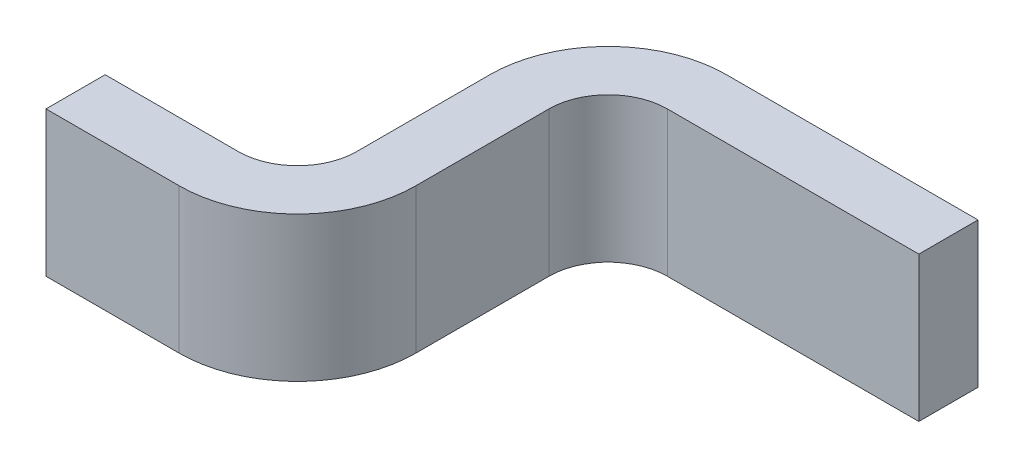
ISO-10303-21;
HEADER;
FILE_DESCRIPTION(('STEP AP214'),'2;1');
FILE_NAME('part.step','',(''),(''),'','','');
FILE_SCHEMA(('AUTOMOTIVE_DESIGN { 1 0 10303 214 1 1 1 1 }'));
ENDSEC;
DATA;
#1=APPLICATION_CONTEXT('core data for automotive mechanical design processes');
#2=APPLICATION_PROTOCOL_DEFINITION('international standard','automotive_design',2000,#1);
#3=PRODUCT_CONTEXT('',#1,'mechanical');
#4=PRODUCT('Part','Part','',(#3));
#5=PRODUCT_RELATED_PRODUCT_CATEGORY('part','',(#4));
#6=PRODUCT_DEFINITION_FORMATION('','',#4);
#7=PRODUCT_DEFINITION_CONTEXT('part definition',#1,'design');
#8=PRODUCT_DEFINITION('design','',#6,#7);
#9=PRODUCT_DEFINITION_SHAPE('','',#8);
#10=(LENGTH_UNIT() NAMED_UNIT(*) SI_UNIT(.MILLI.,.METRE.));
#11=(NAMED_UNIT(*) PLANE_ANGLE_UNIT() SI_UNIT($,.RADIAN.));
#12=(NAMED_UNIT(*) SI_UNIT($,.STERADIAN.) SOLID_ANGLE_UNIT());
#13=UNCERTAINTY_MEASURE_WITH_UNIT(LENGTH_MEASURE(1.E-05),#10,'distance_accuracy_value','');
#14=(GEOMETRIC_REPRESENTATION_CONTEXT(3) GLOBAL_UNCERTAINTY_ASSIGNED_CONTEXT((#13)) GLOBAL_UNIT_ASSIGNED_CONTEXT((#10,
#11,#12)) REPRESENTATION_CONTEXT('',''));
#15=CARTESIAN_POINT('',(0.,0.,0.));
#16=DIRECTION('',(0.,0.,1.));
#17=DIRECTION('',(1.,0.,0.));
#18=AXIS2_PLACEMENT_3D('',#15,#16,#17);
#19=CARTESIAN_POINT('',(0.,0.1225,0.625));
#20=DIRECTION('',(0.,0.,-1.));
#21=DIRECTION('',(-1.,0.,0.));
#22=AXIS2_PLACEMENT_3D('',#19,#20,#21);
#23=PLANE('',#22);
#24=DIRECTION('',(1.,0.,0.));
#25=VECTOR('',#24,1.);
#26=CARTESIAN_POINT('',(0.,0.1225,0.625));
#27=LINE('',#26,#25);
#28=CARTESIAN_POINT('',(0.225,0.1225,0.625));
#29=VERTEX_POINT('',#28);
#30=CARTESIAN_POINT('',(0.,0.1225,0.625));
#31=VERTEX_POINT('',#30);
#32=EDGE_CURVE('E104',#29,#31,#27,.F.);
#33=ORIENTED_EDGE('',*,*,#32,.T.);
#34=DIRECTION('',(0.,1.,0.));
#35=VECTOR('',#34,1.);
#36=CARTESIAN_POINT('',(0.,-0.1225,0.625));
#37=LINE('',#36,#35);
#38=CARTESIAN_POINT('',(0.,-0.1225,0.625));
#39=VERTEX_POINT('',#38);
#40=EDGE_CURVE('E113',#39,#31,#37,.T.);
#41=ORIENTED_EDGE('',*,*,#40,.F.);
#42=DIRECTION('',(1.,0.,0.));
#43=VECTOR('',#42,1.);
#44=CARTESIAN_POINT('',(0.,-0.1225,0.625));
#45=LINE('',#44,#43);
#46=CARTESIAN_POINT('',(0.225,-0.1225,0.625));
#47=VERTEX_POINT('',#46);
#48=EDGE_CURVE('E118',#39,#47,#45,.T.);
#49=ORIENTED_EDGE('',*,*,#48,.T.);
#50=DIRECTION('',(0.,1.,0.));
#51=VECTOR('',#50,1.);
#52=CARTESIAN_POINT('',(0.225,0.1225,0.625));
#53=LINE('',#52,#51);
#54=EDGE_CURVE('E116',#29,#47,#53,.F.);
#55=ORIENTED_EDGE('',*,*,#54,.F.);
#56=EDGE_LOOP('',(#33,#41,#49,#55));
#57=FACE_BOUND('',#56,.T.);
#58=ADVANCED_FACE('F17',(#57),#23,.F.);
#59=CARTESIAN_POINT('',(0.,-0.1225,0.525));
#60=DIRECTION('',(-1.,0.,0.));
#61=DIRECTION('',(0.,0.,1.));
#62=AXIS2_PLACEMENT_3D('',#59,#60,#61);
#63=PLANE('',#62);
#64=DIRECTION('',(0.,0.,1.));
#65=VECTOR('',#64,1.);
#66=CARTESIAN_POINT('',(0.,0.1225,0.525));
#67=LINE('',#66,#65);
#68=CARTESIAN_POINT('',(0.,0.1225,0.525));
#69=VERTEX_POINT('',#68);
#70=EDGE_CURVE('E111',#31,#69,#67,.F.);
#71=ORIENTED_EDGE('',*,*,#70,.T.);
#72=DIRECTION('',(0.,1.,0.));
#73=VECTOR('',#72,1.);
#74=CARTESIAN_POINT('',(0.,-0.1225,0.525));
#75=LINE('',#74,#73);
#76=CARTESIAN_POINT('',(0.,-0.1225,0.525));
#77=VERTEX_POINT('',#76);
#78=EDGE_CURVE('E127',#69,#77,#75,.F.);
#79=ORIENTED_EDGE('',*,*,#78,.T.);
#80=DIRECTION('',(0.,0.,1.));
#81=VECTOR('',#80,1.);
#82=CARTESIAN_POINT('',(0.,-0.1225,0.625));
#83=LINE('',#82,#81);
#84=EDGE_CURVE('E140',#77,#39,#83,.T.);
#85=ORIENTED_EDGE('',*,*,#84,.T.);
#86=ORIENTED_EDGE('',*,*,#40,.T.);
#87=EDGE_LOOP('',(#71,#79,#85,#86));
#88=FACE_BOUND('',#87,.T.);
#89=ADVANCED_FACE('F277',(#88),#63,.T.);
#90=CARTESIAN_POINT('',(0.225,0.1225,0.425));
#91=DIRECTION('',(0.,1.,0.));
#92=DIRECTION('',(0.,0.,1.));
#93=AXIS2_PLACEMENT_3D('',#90,#91,#92);
#94=CYLINDRICAL_SURFACE('',#93,0.2);
#95=CARTESIAN_POINT('',(0.225,0.1225,0.425));
#96=DIRECTION('',(0.,1.,0.));
#97=DIRECTION('',(0.,0.,1.));
#98=AXIS2_PLACEMENT_3D('',#95,#96,#97);
#99=CIRCLE('',#98,0.2);
#100=CARTESIAN_POINT('',(0.425,0.1225,0.425));
#101=VERTEX_POINT('',#100);
#102=EDGE_CURVE('E20',#29,#101,#99,.T.);
#103=ORIENTED_EDGE('',*,*,#102,.F.);
#104=ORIENTED_EDGE('',*,*,#54,.T.);
#105=CARTESIAN_POINT('',(0.225,-0.1225,0.425));
#106=DIRECTION('',(0.,1.,0.));
#107=DIRECTION('',(0.,0.,1.));
#108=AXIS2_PLACEMENT_3D('',#105,#106,#107);
#109=CIRCLE('',#108,0.2);
#110=CARTESIAN_POINT('',(0.425,-0.1225,0.425));
#111=VERTEX_POINT('',#110);
#112=EDGE_CURVE('E178',#111,#47,#109,.F.);
#113=ORIENTED_EDGE('',*,*,#112,.F.);
#114=DIRECTION('',(0.,1.,0.));
#115=VECTOR('',#114,1.);
#116=CARTESIAN_POINT('',(0.425,0.1225,0.425));
#117=LINE('',#116,#115);
#118=EDGE_CURVE('E124',#111,#101,#117,.T.);
#119=ORIENTED_EDGE('',*,*,#118,.T.);
#120=EDGE_LOOP('',(#103,#104,#113,#119));
#121=FACE_BOUND('',#120,.T.);
#122=ADVANCED_FACE('F123',(#121),#94,.T.);
#123=CARTESIAN_POINT('',(0.,-0.1225,0.525));
#124=DIRECTION('',(0.,0.,1.));
#125=DIRECTION('',(1.,0.,0.));
#126=AXIS2_PLACEMENT_3D('',#123,#124,#125);
#127=PLANE('',#126);
#128=DIRECTION('',(1.,0.,0.));
#129=VECTOR('',#128,1.);
#130=CARTESIAN_POINT('',(0.,-0.1225,0.525));
#131=LINE('',#130,#129);
#132=CARTESIAN_POINT('',(0.225,-0.1225,0.525));
#133=VERTEX_POINT('',#132);
#134=EDGE_CURVE('E131',#77,#133,#131,.T.);
#135=ORIENTED_EDGE('',*,*,#134,.F.);
#136=ORIENTED_EDGE('',*,*,#78,.F.);
#137=DIRECTION('',(1.,0.,0.));
#138=VECTOR('',#137,1.);
#139=CARTESIAN_POINT('',(0.,0.1225,0.525));
#140=LINE('',#139,#138);
#141=CARTESIAN_POINT('',(0.225,0.1225,0.525));
#142=VERTEX_POINT('',#141);
#143=EDGE_CURVE('E126',#142,#69,#140,.F.);
#144=ORIENTED_EDGE('',*,*,#143,.F.);
#145=DIRECTION('',(0.,1.,0.));
#146=VECTOR('',#145,1.);
#147=CARTESIAN_POINT('',(0.225,-0.1225,0.525));
#148=LINE('',#147,#146);
#149=EDGE_CURVE('E175',#142,#133,#148,.F.);
#150=ORIENTED_EDGE('',*,*,#149,.T.);
#151=EDGE_LOOP('',(#135,#136,#144,#150));
#152=FACE_BOUND('',#151,.T.);
#153=ADVANCED_FACE('F271',(#152),#127,.F.);
#154=CARTESIAN_POINT('',(0.425,0.1225,0.425));
#155=DIRECTION('',(-1.,0.,0.));
#156=DIRECTION('',(0.,0.,1.));
#157=AXIS2_PLACEMENT_3D('',#154,#155,#156);
#158=PLANE('',#157);
#159=DIRECTION('',(0.,0.,-1.));
#160=VECTOR('',#159,1.);
#161=CARTESIAN_POINT('',(0.425,0.1225,0.425));
#162=LINE('',#161,#160);
#163=CARTESIAN_POINT('',(0.425,0.1225,0.2));
#164=VERTEX_POINT('',#163);
#165=EDGE_CURVE('E177',#164,#101,#162,.F.);
#166=ORIENTED_EDGE('',*,*,#165,.T.);
#167=ORIENTED_EDGE('',*,*,#118,.F.);
#168=DIRECTION('',(0.,0.,1.));
#169=VECTOR('',#168,1.);
#170=CARTESIAN_POINT('',(0.425,-0.1225,0.425));
#171=LINE('',#170,#169);
#172=CARTESIAN_POINT('',(0.425,-0.1225,0.2));
#173=VERTEX_POINT('',#172);
#174=EDGE_CURVE('E174',#111,#173,#171,.F.);
#175=ORIENTED_EDGE('',*,*,#174,.T.);
#176=DIRECTION('',(0.,-1.,0.));
#177=VECTOR('',#176,1.);
#178=CARTESIAN_POINT('',(0.425,0.1225,0.2));
#179=LINE('',#178,#177);
#180=EDGE_CURVE('E171',#173,#164,#179,.F.);
#181=ORIENTED_EDGE('',*,*,#180,.T.);
#182=EDGE_LOOP('',(#166,#167,#175,#181));
#183=FACE_BOUND('',#182,.T.);
#184=ADVANCED_FACE('F267',(#183),#158,.F.);
#185=CARTESIAN_POINT('',(0.225,-0.1225,0.425));
#186=DIRECTION('',(0.,1.,0.));
#187=DIRECTION('',(0.,0.,1.));
#188=AXIS2_PLACEMENT_3D('',#185,#186,#187);
#189=CYLINDRICAL_SURFACE('',#188,0.1);
#190=CARTESIAN_POINT('',(0.225,-0.1225,0.425));
#191=DIRECTION('',(0.,1.,0.));
#192=DIRECTION('',(0.,0.,1.));
#193=AXIS2_PLACEMENT_3D('',#190,#191,#192);
#194=CIRCLE('',#193,0.1);
#195=CARTESIAN_POINT('',(0.325,-0.1225,0.425));
#196=VERTEX_POINT('',#195);
#197=EDGE_CURVE('E172',#133,#196,#194,.T.);
#198=ORIENTED_EDGE('',*,*,#197,.F.);
#199=ORIENTED_EDGE('',*,*,#149,.F.);
#200=CARTESIAN_POINT('',(0.225,0.1225,0.425));
#201=DIRECTION('',(0.,1.,0.));
#202=DIRECTION('',(0.,0.,1.));
#203=AXIS2_PLACEMENT_3D('',#200,#201,#202);
#204=CIRCLE('',#203,0.1);
#205=CARTESIAN_POINT('',(0.325,0.1225,0.425));
#206=VERTEX_POINT('',#205);
#207=EDGE_CURVE('E176',#206,#142,#204,.F.);
#208=ORIENTED_EDGE('',*,*,#207,.F.);
#209=DIRECTION('',(0.,1.,0.));
#210=VECTOR('',#209,1.);
#211=CARTESIAN_POINT('',(0.325,-0.1225,0.425));
#212=LINE('',#211,#210);
#213=EDGE_CURVE('E188',#206,#196,#212,.F.);
#214=ORIENTED_EDGE('',*,*,#213,.T.);
#215=EDGE_LOOP('',(#198,#199,#208,#214));
#216=FACE_BOUND('',#215,.T.);
#217=ADVANCED_FACE('F263',(#216),#189,.F.);
#218=CARTESIAN_POINT('',(0.525,0.1225,0.2));
#219=DIRECTION('',(0.,-1.,0.));
#220=DIRECTION('',(0.,0.,-1.));
#221=AXIS2_PLACEMENT_3D('',#218,#219,#220);
#222=CYLINDRICAL_SURFACE('',#221,0.1);
#223=CARTESIAN_POINT('',(0.525,0.1225,0.2));
#224=DIRECTION('',(0.,-1.,0.));
#225=DIRECTION('',(0.,0.,-1.));
#226=AXIS2_PLACEMENT_3D('',#223,#224,#225);
#227=CIRCLE('',#226,0.1);
#228=CARTESIAN_POINT('',(0.525,0.1225,0.1));
#229=VERTEX_POINT('',#228);
#230=EDGE_CURVE('E168',#164,#229,#227,.T.);
#231=ORIENTED_EDGE('',*,*,#230,.F.);
#232=ORIENTED_EDGE('',*,*,#180,.F.);
#233=CARTESIAN_POINT('',(0.525,-0.1225,0.2));
#234=DIRECTION('',(0.,-1.,0.));
#235=DIRECTION('',(0.,0.,-1.));
#236=AXIS2_PLACEMENT_3D('',#233,#234,#235);
#237=CIRCLE('',#236,0.1);
#238=CARTESIAN_POINT('',(0.525,-0.1225,0.1));
#239=VERTEX_POINT('',#238);
#240=EDGE_CURVE('E163',#239,#173,#237,.F.);
#241=ORIENTED_EDGE('',*,*,#240,.F.);
#242=DIRECTION('',(0.,1.,0.));
#243=VECTOR('',#242,1.);
#244=CARTESIAN_POINT('',(0.525,0.1225,0.1));
#245=LINE('',#244,#243);
#246=EDGE_CURVE('E166',#239,#229,#245,.T.);
#247=ORIENTED_EDGE('',*,*,#246,.T.);
#248=EDGE_LOOP('',(#231,#232,#241,#247));
#249=FACE_BOUND('',#248,.T.);
#250=ADVANCED_FACE('F259',(#249),#222,.F.);
#251=CARTESIAN_POINT('',(0.325,-0.1225,0.425));
#252=DIRECTION('',(1.,0.,0.));
#253=DIRECTION('',(0.,0.,-1.));
#254=AXIS2_PLACEMENT_3D('',#251,#252,#253);
#255=PLANE('',#254);
#256=DIRECTION('',(0.,0.,-1.));
#257=VECTOR('',#256,1.);
#258=CARTESIAN_POINT('',(0.325,-0.1225,0.425));
#259=LINE('',#258,#257);
#260=CARTESIAN_POINT('',(0.325,-0.1225,0.2));
#261=VERTEX_POINT('',#260);
#262=EDGE_CURVE('E167',#196,#261,#259,.T.);
#263=ORIENTED_EDGE('',*,*,#262,.F.);
#264=ORIENTED_EDGE('',*,*,#213,.F.);
#265=DIRECTION('',(0.,0.,-1.));
#266=VECTOR('',#265,1.);
#267=CARTESIAN_POINT('',(0.325,0.1225,0.425));
#268=LINE('',#267,#266);
#269=CARTESIAN_POINT('',(0.325,0.1225,0.2));
#270=VERTEX_POINT('',#269);
#271=EDGE_CURVE('E170',#270,#206,#268,.F.);
#272=ORIENTED_EDGE('',*,*,#271,.F.);
#273=DIRECTION('',(0.,-1.,0.));
#274=VECTOR('',#273,1.);
#275=CARTESIAN_POINT('',(0.325,-0.1225,0.2));
#276=LINE('',#275,#274);
#277=EDGE_CURVE('E159',#261,#270,#276,.F.);
#278=ORIENTED_EDGE('',*,*,#277,.F.);
#279=EDGE_LOOP('',(#263,#264,#272,#278));
#280=FACE_BOUND('',#279,.T.);
#281=ADVANCED_FACE('F255',(#280),#255,.F.);
#282=CARTESIAN_POINT('',(0.525,0.1225,0.1));
#283=DIRECTION('',(0.,0.,-1.));
#284=DIRECTION('',(-1.,0.,0.));
#285=AXIS2_PLACEMENT_3D('',#282,#283,#284);
#286=PLANE('',#285);
#287=DIRECTION('',(1.,0.,0.));
#288=VECTOR('',#287,1.);
#289=CARTESIAN_POINT('',(0.525,0.1225,0.1));
#290=LINE('',#289,#288);
#291=CARTESIAN_POINT('',(0.95,0.1225,0.1));
#292=VERTEX_POINT('',#291);
#293=EDGE_CURVE('E162',#292,#229,#290,.F.);
#294=ORIENTED_EDGE('',*,*,#293,.T.);
#295=ORIENTED_EDGE('',*,*,#246,.F.);
#296=DIRECTION('',(1.,0.,0.));
#297=VECTOR('',#296,1.);
#298=CARTESIAN_POINT('',(0.525,-0.1225,0.1));
#299=LINE('',#298,#297);
#300=CARTESIAN_POINT('',(0.95,-0.1225,0.1));
#301=VERTEX_POINT('',#300);
#302=EDGE_CURVE('E216',#239,#301,#299,.T.);
#303=ORIENTED_EDGE('',*,*,#302,.T.);
#304=DIRECTION('',(0.,1.,0.));
#305=VECTOR('',#304,1.);
#306=CARTESIAN_POINT('',(0.95,-0.1225,0.1));
#307=LINE('',#306,#305);
#308=EDGE_CURVE('E197',#301,#292,#307,.T.);
#309=ORIENTED_EDGE('',*,*,#308,.T.);
#310=EDGE_LOOP('',(#294,#295,#303,#309));
#311=FACE_BOUND('',#310,.T.);
#312=ADVANCED_FACE('F252',(#311),#286,.F.);
#313=CARTESIAN_POINT('',(0.525,0.1225,0.));
#314=DIRECTION('',(0.,-1.,0.));
#315=DIRECTION('',(0.,0.,-1.));
#316=AXIS2_PLACEMENT_3D('',#313,#314,#315);
#317=PLANE('',#316);
#318=DIRECTION('',(1.,0.,0.));
#319=VECTOR('',#318,1.);
#320=CARTESIAN_POINT('',(0.525,0.1225,0.));
#321=LINE('',#320,#319);
#322=CARTESIAN_POINT('',(0.95,0.1225,0.));
#323=VERTEX_POINT('',#322);
#324=CARTESIAN_POINT('',(0.525,0.1225,0.));
#325=VERTEX_POINT('',#324);
#326=EDGE_CURVE('E205',#323,#325,#321,.F.);
#327=ORIENTED_EDGE('',*,*,#326,.T.);
#328=CARTESIAN_POINT('',(0.525,0.1225,0.2));
#329=DIRECTION('',(0.,-1.,0.));
#330=DIRECTION('',(0.,0.,-1.));
#331=AXIS2_PLACEMENT_3D('',#328,#329,#330);
#332=CIRCLE('',#331,0.2);
#333=EDGE_CURVE('E160',#270,#325,#332,.T.);
#334=ORIENTED_EDGE('',*,*,#333,.F.);
#335=ORIENTED_EDGE('',*,*,#271,.T.);
#336=ORIENTED_EDGE('',*,*,#207,.T.);
#337=ORIENTED_EDGE('',*,*,#143,.T.);
#338=ORIENTED_EDGE('',*,*,#70,.F.);
#339=ORIENTED_EDGE('',*,*,#32,.F.);
#340=ORIENTED_EDGE('',*,*,#102,.T.);
#341=ORIENTED_EDGE('',*,*,#165,.F.);
#342=ORIENTED_EDGE('',*,*,#230,.T.);
#343=ORIENTED_EDGE('',*,*,#293,.F.);
#344=DIRECTION('',(0.,0.,1.));
#345=VECTOR('',#344,1.);
#346=CARTESIAN_POINT('',(0.95,0.1225,0.));
#347=LINE('',#346,#345);
#348=EDGE_CURVE('E200',#292,#323,#347,.F.);
#349=ORIENTED_EDGE('',*,*,#348,.T.);
#350=EDGE_LOOP('',(#327,#334,#335,#336,#337,#338,#339,#340,#341,#342,#343,#349));
#351=FACE_BOUND('',#350,.T.);
#352=ADVANCED_FACE('F107',(#351),#317,.F.);
#353=CARTESIAN_POINT('',(0.525,-0.1225,0.2));
#354=DIRECTION('',(0.,-1.,0.));
#355=DIRECTION('',(0.,0.,-1.));
#356=AXIS2_PLACEMENT_3D('',#353,#354,#355);
#357=CYLINDRICAL_SURFACE('',#356,0.2);
#358=CARTESIAN_POINT('',(0.525,-0.1225,0.2));
#359=DIRECTION('',(0.,-1.,0.));
#360=DIRECTION('',(0.,0.,-1.));
#361=AXIS2_PLACEMENT_3D('',#358,#359,#360);
#362=CIRCLE('',#361,0.2);
#363=CARTESIAN_POINT('',(0.525,-0.1225,0.));
#364=VERTEX_POINT('',#363);
#365=EDGE_CURVE('E157',#364,#261,#362,.F.);
#366=ORIENTED_EDGE('',*,*,#365,.T.);
#367=ORIENTED_EDGE('',*,*,#277,.T.);
#368=ORIENTED_EDGE('',*,*,#333,.T.);
#369=DIRECTION('',(0.,1.,0.));
#370=VECTOR('',#369,1.);
#371=CARTESIAN_POINT('',(0.525,-0.1225,0.));
#372=LINE('',#371,#370);
#373=EDGE_CURVE('E211',#325,#364,#372,.F.);
#374=ORIENTED_EDGE('',*,*,#373,.T.);
#375=EDGE_LOOP('',(#366,#367,#368,#374));
#376=FACE_BOUND('',#375,.T.);
#377=ADVANCED_FACE('F233',(#376),#357,.T.);
#378=CARTESIAN_POINT('',(0.525,-0.1225,0.1));
#379=DIRECTION('',(0.,1.,0.));
#380=DIRECTION('',(0.,0.,1.));
#381=AXIS2_PLACEMENT_3D('',#378,#379,#380);
#382=PLANE('',#381);
#383=ORIENTED_EDGE('',*,*,#302,.F.);
#384=ORIENTED_EDGE('',*,*,#240,.T.);
#385=ORIENTED_EDGE('',*,*,#174,.F.);
#386=ORIENTED_EDGE('',*,*,#112,.T.);
#387=ORIENTED_EDGE('',*,*,#48,.F.);
#388=ORIENTED_EDGE('',*,*,#84,.F.);
#389=ORIENTED_EDGE('',*,*,#134,.T.);
#390=ORIENTED_EDGE('',*,*,#197,.T.);
#391=ORIENTED_EDGE('',*,*,#262,.T.);
#392=ORIENTED_EDGE('',*,*,#365,.F.);
#393=DIRECTION('',(1.,0.,0.));
#394=VECTOR('',#393,1.);
#395=CARTESIAN_POINT('',(0.525,-0.1225,0.));
#396=LINE('',#395,#394);
#397=CARTESIAN_POINT('',(0.95,-0.1225,0.));
#398=VERTEX_POINT('',#397);
#399=EDGE_CURVE('E26',#364,#398,#396,.T.);
#400=ORIENTED_EDGE('',*,*,#399,.T.);
#401=DIRECTION('',(0.,0.,1.));
#402=VECTOR('',#401,1.);
#403=CARTESIAN_POINT('',(0.95,-0.1225,0.));
#404=LINE('',#403,#402);
#405=EDGE_CURVE('E34',#398,#301,#404,.T.);
#406=ORIENTED_EDGE('',*,*,#405,.T.);
#407=EDGE_LOOP('',(#383,#384,#385,#386,#387,#388,#389,#390,#391,#392,#400,#406));
#408=FACE_BOUND('',#407,.T.);
#409=ADVANCED_FACE('F227',(#408),#382,.F.);
#410=CARTESIAN_POINT('',(0.95,-0.1225,0.));
#411=DIRECTION('',(-1.,0.,0.));
#412=DIRECTION('',(0.,0.,1.));
#413=AXIS2_PLACEMENT_3D('',#410,#411,#412);
#414=PLANE('',#413);
#415=ORIENTED_EDGE('',*,*,#348,.F.);
#416=ORIENTED_EDGE('',*,*,#308,.F.);
#417=ORIENTED_EDGE('',*,*,#405,.F.);
#418=DIRECTION('',(0.,1.,0.));
#419=VECTOR('',#418,1.);
#420=CARTESIAN_POINT('',(0.95,-0.1225,0.));
#421=LINE('',#420,#419);
#422=EDGE_CURVE('E11',#398,#323,#421,.T.);
#423=ORIENTED_EDGE('',*,*,#422,.T.);
#424=EDGE_LOOP('',(#415,#416,#417,#423));
#425=FACE_BOUND('',#424,.T.);
#426=ADVANCED_FACE('F237',(#425),#414,.F.);
#427=CARTESIAN_POINT('',(0.525,-0.1225,0.));
#428=DIRECTION('',(0.,0.,1.));
#429=DIRECTION('',(1.,0.,0.));
#430=AXIS2_PLACEMENT_3D('',#427,#428,#429);
#431=PLANE('',#430);
#432=ORIENTED_EDGE('',*,*,#399,.F.);
#433=ORIENTED_EDGE('',*,*,#373,.F.);
#434=ORIENTED_EDGE('',*,*,#326,.F.);
#435=ORIENTED_EDGE('',*,*,#422,.F.);
#436=EDGE_LOOP('',(#432,#433,#434,#435));
#437=FACE_BOUND('',#436,.T.);
#438=ADVANCED_FACE('F231',(#437),#431,.F.);
#439=CLOSED_SHELL('',(#58,#89,#122,#153,#184,#217,#250,#281,#312,#352,#377,#409,#426,#438));
#440=MANIFOLD_SOLID_BREP('B1',#439);
#441=ADVANCED_BREP_SHAPE_REPRESENTATION('',(#18,#440),#14);
#442=SHAPE_DEFINITION_REPRESENTATION(#9,#441);
ENDSEC;
END-ISO-10303-21;
